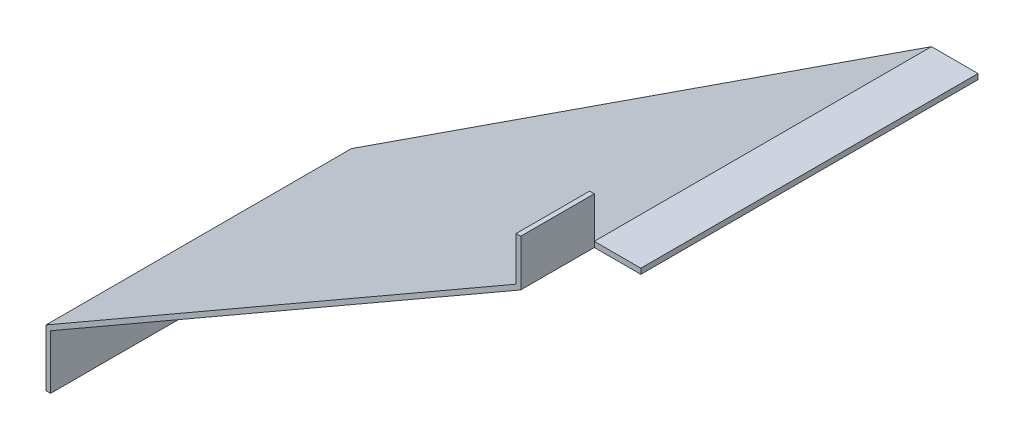
ISO-10303-21;
HEADER;
FILE_DESCRIPTION(('STEP AP214'),'2;1');
FILE_NAME('part.step','',(''),(''),'','','');
FILE_SCHEMA(('AUTOMOTIVE_DESIGN { 1 0 10303 214 1 1 1 1 }'));
ENDSEC;
DATA;
#1=APPLICATION_CONTEXT('core data for automotive mechanical design processes');
#2=APPLICATION_PROTOCOL_DEFINITION('international standard','automotive_design',2000,#1);
#3=PRODUCT_CONTEXT('',#1,'mechanical');
#4=PRODUCT('Part','Part','',(#3));
#5=PRODUCT_RELATED_PRODUCT_CATEGORY('part','',(#4));
#6=PRODUCT_DEFINITION_FORMATION('','',#4);
#7=PRODUCT_DEFINITION_CONTEXT('part definition',#1,'design');
#8=PRODUCT_DEFINITION('design','',#6,#7);
#9=PRODUCT_DEFINITION_SHAPE('','',#8);
#10=(LENGTH_UNIT() NAMED_UNIT(*) SI_UNIT(.MILLI.,.METRE.));
#11=(NAMED_UNIT(*) PLANE_ANGLE_UNIT() SI_UNIT($,.RADIAN.));
#12=(NAMED_UNIT(*) SI_UNIT($,.STERADIAN.) SOLID_ANGLE_UNIT());
#13=UNCERTAINTY_MEASURE_WITH_UNIT(LENGTH_MEASURE(1.E-05),#10,'distance_accuracy_value','');
#14=(GEOMETRIC_REPRESENTATION_CONTEXT(3) GLOBAL_UNCERTAINTY_ASSIGNED_CONTEXT((#13)) GLOBAL_UNIT_ASSIGNED_CONTEXT((#10,
#11,#12)) REPRESENTATION_CONTEXT('',''));
#15=CARTESIAN_POINT('',(0.,0.,0.));
#16=DIRECTION('',(0.,0.,1.));
#17=DIRECTION('',(1.,0.,0.));
#18=AXIS2_PLACEMENT_3D('',#15,#16,#17);
#19=CARTESIAN_POINT('',(29.337,-633.388813657917,860.382512117968));
#20=DIRECTION('',(0.,1.,0.));
#21=DIRECTION('',(1.,0.,0.));
#22=AXIS2_PLACEMENT_3D('',#19,#20,#21);
#23=PLANE('',#22);
#24=DIRECTION('',(0.,0.,-1.));
#25=VECTOR('',#24,1.);
#26=CARTESIAN_POINT('',(26.162,-633.388813657917,860.382512117968));
#27=LINE('',#26,#25);
#28=CARTESIAN_POINT('',(26.162,-633.388813657917,964.565));
#29=VERTEX_POINT('',#28);
#30=CARTESIAN_POINT('',(26.162,-633.388813657917,756.200024235936));
#31=VERTEX_POINT('',#30);
#32=EDGE_CURVE('E230',#29,#31,#27,.T.);
#33=ORIENTED_EDGE('',*,*,#32,.T.);
#34=DIRECTION('',(-1.,0.,0.));
#35=VECTOR('',#34,1.);
#36=CARTESIAN_POINT('',(29.337,-633.388813657917,756.200024235936));
#37=LINE('',#36,#35);
#38=CARTESIAN_POINT('',(29.337,-633.388813657917,756.200024235936));
#39=VERTEX_POINT('',#38);
#40=EDGE_CURVE('E20',#39,#31,#37,.T.);
#41=ORIENTED_EDGE('',*,*,#40,.F.);
#42=DIRECTION('',(0.,0.,-1.));
#43=VECTOR('',#42,1.);
#44=CARTESIAN_POINT('',(29.337,-633.388813657917,860.382512117968));
#45=LINE('',#44,#43);
#46=CARTESIAN_POINT('',(29.337,-633.388813657917,964.565));
#47=VERTEX_POINT('',#46);
#48=EDGE_CURVE('E11',#47,#39,#45,.T.);
#49=ORIENTED_EDGE('',*,*,#48,.F.);
#50=DIRECTION('',(-1.,0.,0.));
#51=VECTOR('',#50,1.);
#52=CARTESIAN_POINT('',(29.337,-633.388813657917,964.565));
#53=LINE('',#52,#51);
#54=EDGE_CURVE('E268',#47,#29,#53,.T.);
#55=ORIENTED_EDGE('',*,*,#54,.T.);
#56=EDGE_LOOP('',(#33,#41,#49,#55));
#57=FACE_BOUND('',#56,.T.);
#58=ADVANCED_FACE('F17',(#57),#23,.F.);
#59=CARTESIAN_POINT('',(29.337,-613.971504257917,860.382512117968));
#60=DIRECTION('',(-1.,0.,0.));
#61=DIRECTION('',(0.,1.,0.));
#62=AXIS2_PLACEMENT_3D('',#59,#60,#61);
#63=PLANE('',#62);
#64=DIRECTION('',(0.,-1.,0.));
#65=VECTOR('',#64,1.);
#66=CARTESIAN_POINT('',(29.337,-615.802809002632,756.200024235936));
#67=LINE('',#66,#65);
#68=CARTESIAN_POINT('',(29.337,-596.390857121367,756.200024235936));
#69=VERTEX_POINT('',#68);
#70=EDGE_CURVE('E228',#69,#39,#67,.T.);
#71=ORIENTED_EDGE('',*,*,#70,.F.);
#72=DIRECTION('',(0.,0.,1.));
#73=VECTOR('',#72,1.);
#74=CARTESIAN_POINT('',(29.337,-596.390857121367,136.396));
#75=LINE('',#74,#73);
#76=CARTESIAN_POINT('',(29.337,-596.390857121367,964.565));
#77=VERTEX_POINT('',#76);
#78=EDGE_CURVE('E250',#69,#77,#75,.T.);
#79=ORIENTED_EDGE('',*,*,#78,.T.);
#80=DIRECTION('',(0.,-1.,0.));
#81=VECTOR('',#80,1.);
#82=CARTESIAN_POINT('',(29.337,-615.802809002632,964.565));
#83=LINE('',#82,#81);
#84=EDGE_CURVE('E272',#77,#47,#83,.T.);
#85=ORIENTED_EDGE('',*,*,#84,.T.);
#86=ORIENTED_EDGE('',*,*,#48,.T.);
#87=EDGE_LOOP('',(#71,#79,#85,#86));
#88=FACE_BOUND('',#87,.T.);
#89=ADVANCED_FACE('F305',(#88),#63,.F.);
#90=CARTESIAN_POINT('',(29.337,-615.802809002632,756.200024235936));
#91=DIRECTION('',(0.,0.,-1.));
#92=DIRECTION('',(0.,-1.,0.));
#93=AXIS2_PLACEMENT_3D('',#90,#91,#92);
#94=PLANE('',#93);
#95=DIRECTION('',(-0.866868283163186,-0.498537239978831,0.));
#96=VECTOR('',#95,1.);
#97=CARTESIAN_POINT('',(187.706,-505.312609489431,756.200024235936));
#98=LINE('',#97,#96);
#99=CARTESIAN_POINT('',(26.162,-598.216804347348,756.200024235936));
#100=VERTEX_POINT('',#99);
#101=EDGE_CURVE('E253',#69,#100,#98,.T.);
#102=ORIENTED_EDGE('',*,*,#101,.F.);
#103=ORIENTED_EDGE('',*,*,#70,.T.);
#104=ORIENTED_EDGE('',*,*,#40,.T.);
#105=DIRECTION('',(0.,-1.,0.));
#106=VECTOR('',#105,1.);
#107=CARTESIAN_POINT('',(26.162,-615.802809002632,756.200024235936));
#108=LINE('',#107,#106);
#109=EDGE_CURVE('E223',#100,#31,#108,.T.);
#110=ORIENTED_EDGE('',*,*,#109,.F.);
#111=EDGE_LOOP('',(#102,#103,#104,#110));
#112=FACE_BOUND('',#111,.T.);
#113=ADVANCED_FACE('F266',(#112),#94,.T.);
#114=CARTESIAN_POINT('',(26.162,-589.865183129732,724.281));
#115=DIRECTION('',(-1.,0.,0.));
#116=DIRECTION('',(0.,1.,0.));
#117=AXIS2_PLACEMENT_3D('',#114,#115,#116);
#118=PLANE('',#117);
#119=DIRECTION('',(0.,-1.,0.));
#120=VECTOR('',#119,1.);
#121=CARTESIAN_POINT('',(26.162,-660.4,756.200024235936));
#122=LINE('',#121,#120);
#123=CARTESIAN_POINT('',(26.162,-594.554194857917,756.200024235936));
#124=VERTEX_POINT('',#123);
#125=EDGE_CURVE('E139',#124,#100,#122,.T.);
#126=ORIENTED_EDGE('',*,*,#125,.T.);
#127=ORIENTED_EDGE('',*,*,#109,.T.);
#128=ORIENTED_EDGE('',*,*,#32,.F.);
#129=DIRECTION('',(0.,-1.,0.));
#130=VECTOR('',#129,1.);
#131=CARTESIAN_POINT('',(26.162,-589.865183129732,964.565));
#132=LINE('',#131,#130);
#133=CARTESIAN_POINT('',(26.162,-594.554194857917,964.565));
#134=VERTEX_POINT('',#133);
#135=EDGE_CURVE('E142',#134,#29,#132,.T.);
#136=ORIENTED_EDGE('',*,*,#135,.F.);
#137=DIRECTION('',(0.,0.,1.));
#138=VECTOR('',#137,1.);
#139=CARTESIAN_POINT('',(26.162,-594.554194857917,724.281));
#140=LINE('',#139,#138);
#141=EDGE_CURVE('E134',#124,#134,#140,.T.);
#142=ORIENTED_EDGE('',*,*,#141,.F.);
#143=EDGE_LOOP('',(#126,#127,#128,#136,#142));
#144=FACE_BOUND('',#143,.T.);
#145=ADVANCED_FACE('F136',(#144),#118,.T.);
#146=CARTESIAN_POINT('',(381.762,-396.095187297279,824.48460386951));
#147=DIRECTION('',(1.,0.,0.));
#148=DIRECTION('',(0.,1.,0.));
#149=AXIS2_PLACEMENT_3D('',#146,#147,#148);
#150=PLANE('',#149);
#151=DIRECTION('',(0.,0.,-1.));
#152=VECTOR('',#151,1.);
#153=CARTESIAN_POINT('',(381.762,-408.307577807848,136.396));
#154=LINE('',#153,#152);
#155=CARTESIAN_POINT('',(381.762,-408.307577807848,914.4));
#156=VERTEX_POINT('',#155);
#157=CARTESIAN_POINT('',(381.762,-408.307577807848,684.40420773902));
#158=VERTEX_POINT('',#157);
#159=EDGE_CURVE('E197',#156,#158,#154,.T.);
#160=ORIENTED_EDGE('',*,*,#159,.F.);
#161=DIRECTION('',(0.,-1.,0.));
#162=VECTOR('',#161,1.);
#163=CARTESIAN_POINT('',(381.762,-410.138882552564,914.4));
#164=LINE('',#163,#162);
#165=CARTESIAN_POINT('',(381.762,-411.970187297279,914.4));
#166=VERTEX_POINT('',#165);
#167=EDGE_CURVE('E188',#156,#166,#164,.T.);
#168=ORIENTED_EDGE('',*,*,#167,.T.);
#169=DIRECTION('',(0.,0.,1.));
#170=VECTOR('',#169,1.);
#171=CARTESIAN_POINT('',(381.762,-411.970187297279,136.396));
#172=LINE('',#171,#170);
#173=CARTESIAN_POINT('',(381.762,-411.970187297279,684.40420773902));
#174=VERTEX_POINT('',#173);
#175=EDGE_CURVE('E187',#174,#166,#172,.T.);
#176=ORIENTED_EDGE('',*,*,#175,.F.);
#177=DIRECTION('',(0.,1.,0.));
#178=VECTOR('',#177,1.);
#179=CARTESIAN_POINT('',(381.762,-325.12,684.40420773902));
#180=LINE('',#179,#178);
#181=EDGE_CURVE('E220',#174,#158,#180,.T.);
#182=ORIENTED_EDGE('',*,*,#181,.T.);
#183=EDGE_LOOP('',(#160,#168,#176,#182));
#184=FACE_BOUND('',#183,.T.);
#185=ADVANCED_FACE('F325',(#184),#150,.T.);
#186=CARTESIAN_POINT('',(381.762,-325.12,684.40420773902));
#187=DIRECTION('',(0.,0.,1.));
#188=DIRECTION('',(1.,0.,0.));
#189=AXIS2_PLACEMENT_3D('',#186,#187,#188);
#190=PLANE('',#189);
#191=DIRECTION('',(0.,1.,0.));
#192=VECTOR('',#191,1.);
#193=CARTESIAN_POINT('',(350.012,-325.12,684.40420773902));
#194=LINE('',#193,#192);
#195=CARTESIAN_POINT('',(350.012,-411.970187297279,684.40420773902));
#196=VERTEX_POINT('',#195);
#197=CARTESIAN_POINT('',(350.012,-408.307577807848,684.40420773902));
#198=VERTEX_POINT('',#197);
#199=EDGE_CURVE('E161',#196,#198,#194,.T.);
#200=ORIENTED_EDGE('',*,*,#199,.T.);
#201=DIRECTION('',(-1.,0.,0.));
#202=VECTOR('',#201,1.);
#203=CARTESIAN_POINT('',(381.762,-408.307577807848,684.40420773902));
#204=LINE('',#203,#202);
#205=EDGE_CURVE('E193',#158,#198,#204,.T.);
#206=ORIENTED_EDGE('',*,*,#205,.F.);
#207=ORIENTED_EDGE('',*,*,#181,.F.);
#208=DIRECTION('',(-1.,0.,0.));
#209=VECTOR('',#208,1.);
#210=CARTESIAN_POINT('',(381.762,-411.970187297279,684.40420773902));
#211=LINE('',#210,#209);
#212=EDGE_CURVE('E185',#174,#196,#211,.T.);
#213=ORIENTED_EDGE('',*,*,#212,.T.);
#214=EDGE_LOOP('',(#200,#206,#207,#213));
#215=FACE_BOUND('',#214,.T.);
#216=ADVANCED_FACE('F322',(#215),#190,.F.);
#217=CARTESIAN_POINT('',(381.762,-411.970187297279,136.396));
#218=DIRECTION('',(0.,-1.,0.));
#219=DIRECTION('',(0.,0.,-1.));
#220=AXIS2_PLACEMENT_3D('',#217,#218,#219);
#221=PLANE('',#220);
#222=DIRECTION('',(0.,0.,1.));
#223=VECTOR('',#222,1.);
#224=CARTESIAN_POINT('',(350.012,-411.970187297279,136.396));
#225=LINE('',#224,#223);
#226=CARTESIAN_POINT('',(350.012,-411.970187297279,914.4));
#227=VERTEX_POINT('',#226);
#228=EDGE_CURVE('E174',#196,#227,#225,.T.);
#229=ORIENTED_EDGE('',*,*,#228,.F.);
#230=ORIENTED_EDGE('',*,*,#212,.F.);
#231=ORIENTED_EDGE('',*,*,#175,.T.);
#232=DIRECTION('',(-1.,0.,0.));
#233=VECTOR('',#232,1.);
#234=CARTESIAN_POINT('',(381.762,-411.970187297279,914.4));
#235=LINE('',#234,#233);
#236=EDGE_CURVE('E196',#166,#227,#235,.T.);
#237=ORIENTED_EDGE('',*,*,#236,.T.);
#238=EDGE_LOOP('',(#229,#230,#231,#237));
#239=FACE_BOUND('',#238,.T.);
#240=ADVANCED_FACE('F320',(#239),#221,.T.);
#241=CARTESIAN_POINT('',(381.762,-410.138882552564,914.4));
#242=DIRECTION('',(0.,0.,-1.));
#243=DIRECTION('',(0.,-1.,0.));
#244=AXIS2_PLACEMENT_3D('',#241,#242,#243);
#245=PLANE('',#244);
#246=DIRECTION('',(0.,-1.,0.));
#247=VECTOR('',#246,1.);
#248=CARTESIAN_POINT('',(350.012,-410.138882552564,914.4));
#249=LINE('',#248,#247);
#250=CARTESIAN_POINT('',(350.012,-408.307577807848,914.4));
#251=VERTEX_POINT('',#250);
#252=EDGE_CURVE('E178',#251,#227,#249,.T.);
#253=ORIENTED_EDGE('',*,*,#252,.T.);
#254=ORIENTED_EDGE('',*,*,#236,.F.);
#255=ORIENTED_EDGE('',*,*,#167,.F.);
#256=DIRECTION('',(-1.,0.,0.));
#257=VECTOR('',#256,1.);
#258=CARTESIAN_POINT('',(381.762,-408.307577807848,914.4));
#259=LINE('',#258,#257);
#260=EDGE_CURVE('E212',#156,#251,#259,.T.);
#261=ORIENTED_EDGE('',*,*,#260,.T.);
#262=EDGE_LOOP('',(#253,#254,#255,#261));
#263=FACE_BOUND('',#262,.T.);
#264=ADVANCED_FACE('F317',(#263),#245,.F.);
#265=CARTESIAN_POINT('',(381.762,-408.307577807848,136.396));
#266=DIRECTION('',(0.,1.,0.));
#267=DIRECTION('',(1.,0.,0.));
#268=AXIS2_PLACEMENT_3D('',#265,#266,#267);
#269=PLANE('',#268);
#270=DIRECTION('',(0.,0.,-1.));
#271=VECTOR('',#270,1.);
#272=CARTESIAN_POINT('',(350.012,-408.307577807848,136.396));
#273=LINE('',#272,#271);
#274=EDGE_CURVE('E156',#251,#198,#273,.T.);
#275=ORIENTED_EDGE('',*,*,#274,.F.);
#276=ORIENTED_EDGE('',*,*,#260,.F.);
#277=ORIENTED_EDGE('',*,*,#159,.T.);
#278=ORIENTED_EDGE('',*,*,#205,.T.);
#279=EDGE_LOOP('',(#275,#276,#277,#278));
#280=FACE_BOUND('',#279,.T.);
#281=ADVANCED_FACE('F315',(#280),#269,.T.);
#282=CARTESIAN_POINT('',(346.837,-380.220187297279,939.4825));
#283=DIRECTION('',(0.,-1.,0.));
#284=DIRECTION('',(0.,0.,-1.));
#285=AXIS2_PLACEMENT_3D('',#282,#283,#284);
#286=PLANE('',#285);
#287=DIRECTION('',(0.,0.,-1.));
#288=VECTOR('',#287,1.);
#289=CARTESIAN_POINT('',(350.012,-380.220187297279,939.4825));
#290=LINE('',#289,#288);
#291=CARTESIAN_POINT('',(350.012,-380.220187297279,964.565));
#292=VERTEX_POINT('',#291);
#293=CARTESIAN_POINT('',(350.012,-380.220187297279,914.4));
#294=VERTEX_POINT('',#293);
#295=EDGE_CURVE('E148',#292,#294,#290,.T.);
#296=ORIENTED_EDGE('',*,*,#295,.T.);
#297=DIRECTION('',(1.,0.,0.));
#298=VECTOR('',#297,1.);
#299=CARTESIAN_POINT('',(346.837,-380.220187297279,914.4));
#300=LINE('',#299,#298);
#301=CARTESIAN_POINT('',(346.837,-380.220187297279,914.4));
#302=VERTEX_POINT('',#301);
#303=EDGE_CURVE('E206',#302,#294,#300,.T.);
#304=ORIENTED_EDGE('',*,*,#303,.F.);
#305=DIRECTION('',(0.,0.,-1.));
#306=VECTOR('',#305,1.);
#307=CARTESIAN_POINT('',(346.837,-380.220187297279,939.4825));
#308=LINE('',#307,#306);
#309=CARTESIAN_POINT('',(346.837,-380.220187297279,964.565));
#310=VERTEX_POINT('',#309);
#311=EDGE_CURVE('E209',#310,#302,#308,.T.);
#312=ORIENTED_EDGE('',*,*,#311,.F.);
#313=DIRECTION('',(1.,0.,0.));
#314=VECTOR('',#313,1.);
#315=CARTESIAN_POINT('',(346.837,-380.220187297279,964.565));
#316=LINE('',#315,#314);
#317=EDGE_CURVE('E245',#310,#292,#316,.T.);
#318=ORIENTED_EDGE('',*,*,#317,.T.);
#319=EDGE_LOOP('',(#296,#304,#312,#318));
#320=FACE_BOUND('',#319,.T.);
#321=ADVANCED_FACE('F303',(#320),#286,.F.);
#322=CARTESIAN_POINT('',(346.837,-396.095187297279,939.4825));
#323=DIRECTION('',(1.,0.,0.));
#324=DIRECTION('',(0.,1.,0.));
#325=AXIS2_PLACEMENT_3D('',#322,#323,#324);
#326=PLANE('',#325);
#327=DIRECTION('',(0.,1.,0.));
#328=VECTOR('',#327,1.);
#329=CARTESIAN_POINT('',(346.837,-394.263882552564,914.4));
#330=LINE('',#329,#328);
#331=CARTESIAN_POINT('',(346.837,-410.133525033829,914.4));
#332=VERTEX_POINT('',#331);
#333=EDGE_CURVE('E202',#332,#302,#330,.T.);
#334=ORIENTED_EDGE('',*,*,#333,.F.);
#335=DIRECTION('',(0.,0.,1.));
#336=VECTOR('',#335,1.);
#337=CARTESIAN_POINT('',(346.837,-410.133525033829,136.396));
#338=LINE('',#337,#336);
#339=CARTESIAN_POINT('',(346.837,-410.133525033829,964.565));
#340=VERTEX_POINT('',#339);
#341=EDGE_CURVE('E147',#332,#340,#338,.T.);
#342=ORIENTED_EDGE('',*,*,#341,.T.);
#343=DIRECTION('',(0.,1.,0.));
#344=VECTOR('',#343,1.);
#345=CARTESIAN_POINT('',(346.837,-394.263882552564,964.565));
#346=LINE('',#345,#344);
#347=EDGE_CURVE('E246',#340,#310,#346,.T.);
#348=ORIENTED_EDGE('',*,*,#347,.T.);
#349=ORIENTED_EDGE('',*,*,#311,.T.);
#350=EDGE_LOOP('',(#334,#342,#348,#349));
#351=FACE_BOUND('',#350,.T.);
#352=ADVANCED_FACE('F353',(#351),#326,.F.);
#353=CARTESIAN_POINT('',(346.837,-394.263882552564,914.4));
#354=DIRECTION('',(0.,0.,-1.));
#355=DIRECTION('',(0.,-1.,0.));
#356=AXIS2_PLACEMENT_3D('',#353,#354,#355);
#357=PLANE('',#356);
#358=DIRECTION('',(0.866868283163186,0.498537239978831,0.));
#359=VECTOR('',#358,1.);
#360=CARTESIAN_POINT('',(187.706,-501.65,914.4));
#361=LINE('',#360,#359);
#362=EDGE_CURVE('E192',#332,#251,#361,.T.);
#363=ORIENTED_EDGE('',*,*,#362,.F.);
#364=ORIENTED_EDGE('',*,*,#333,.T.);
#365=ORIENTED_EDGE('',*,*,#303,.T.);
#366=DIRECTION('',(0.,1.,0.));
#367=VECTOR('',#366,1.);
#368=CARTESIAN_POINT('',(350.012,-394.263882552564,914.4));
#369=LINE('',#368,#367);
#370=EDGE_CURVE('E181',#251,#294,#369,.T.);
#371=ORIENTED_EDGE('',*,*,#370,.F.);
#372=EDGE_LOOP('',(#363,#364,#365,#371));
#373=FACE_BOUND('',#372,.T.);
#374=ADVANCED_FACE('F355',(#373),#357,.T.);
#375=CARTESIAN_POINT('',(187.706,-501.65,136.396));
#376=DIRECTION('',(0.498537239978831,-0.866868283163186,0.));
#377=DIRECTION('',(0.,0.,-1.));
#378=AXIS2_PLACEMENT_3D('',#375,#376,#377);
#379=PLANE('',#378);
#380=DIRECTION('',(-0.851290383944916,-0.489578366950732,0.188726534479847));
#381=VECTOR('',#380,1.);
#382=CARTESIAN_POINT('',(281.530559893111,-447.691355947805,699.586177500819));
#383=LINE('',#382,#381);
#384=EDGE_CURVE('E152',#198,#124,#383,.T.);
#385=ORIENTED_EDGE('',*,*,#384,.T.);
#386=ORIENTED_EDGE('',*,*,#141,.T.);
#387=DIRECTION('',(0.866868283163186,0.498537239978831,0.));
#388=VECTOR('',#387,1.);
#389=CARTESIAN_POINT('',(187.706,-501.65,964.565));
#390=LINE('',#389,#388);
#391=EDGE_CURVE('E249',#134,#340,#390,.T.);
#392=ORIENTED_EDGE('',*,*,#391,.T.);
#393=ORIENTED_EDGE('',*,*,#341,.F.);
#394=ORIENTED_EDGE('',*,*,#362,.T.);
#395=ORIENTED_EDGE('',*,*,#274,.T.);
#396=EDGE_LOOP('',(#385,#386,#392,#393,#394,#395));
#397=FACE_BOUND('',#396,.T.);
#398=ADVANCED_FACE('F153',(#397),#379,.F.);
#399=CARTESIAN_POINT('',(350.012,-325.12,939.8));
#400=DIRECTION('',(-1.,0.,0.));
#401=DIRECTION('',(0.,0.,1.));
#402=AXIS2_PLACEMENT_3D('',#399,#400,#401);
#403=PLANE('',#402);
#404=ORIENTED_EDGE('',*,*,#252,.F.);
#405=ORIENTED_EDGE('',*,*,#370,.T.);
#406=ORIENTED_EDGE('',*,*,#295,.F.);
#407=DIRECTION('',(0.,-1.,0.));
#408=VECTOR('',#407,1.);
#409=CARTESIAN_POINT('',(350.012,-330.2,964.565));
#410=LINE('',#409,#408);
#411=CARTESIAN_POINT('',(350.012,-411.970187297279,964.565));
#412=VERTEX_POINT('',#411);
#413=EDGE_CURVE('E290',#292,#412,#410,.T.);
#414=ORIENTED_EDGE('',*,*,#413,.T.);
#415=DIRECTION('',(0.,0.,1.));
#416=VECTOR('',#415,1.);
#417=CARTESIAN_POINT('',(350.012,-411.970187297279,136.396));
#418=LINE('',#417,#416);
#419=EDGE_CURVE('E168',#227,#412,#418,.T.);
#420=ORIENTED_EDGE('',*,*,#419,.F.);
#421=EDGE_LOOP('',(#404,#405,#406,#414,#420));
#422=FACE_BOUND('',#421,.T.);
#423=ADVANCED_FACE('F438',(#422),#403,.F.);
#424=CARTESIAN_POINT('',(359.537,-660.4,682.292566077346));
#425=DIRECTION('',(0.216439613938103,0.,0.976296007119933));
#426=DIRECTION('',(0.,-1.,0.));
#427=AXIS2_PLACEMENT_3D('',#424,#425,#426);
#428=PLANE('',#427);
#429=ORIENTED_EDGE('',*,*,#125,.F.);
#430=ORIENTED_EDGE('',*,*,#384,.F.);
#431=ORIENTED_EDGE('',*,*,#199,.F.);
#432=DIRECTION('',(0.851290383944916,0.489578366950732,-0.188726534479847));
#433=VECTOR('',#432,1.);
#434=CARTESIAN_POINT('',(281.530559893111,-451.353965437236,699.586177500819));
#435=LINE('',#434,#433);
#436=EDGE_CURVE('E165',#100,#196,#435,.T.);
#437=ORIENTED_EDGE('',*,*,#436,.F.);
#438=EDGE_LOOP('',(#429,#430,#431,#437));
#439=FACE_BOUND('',#438,.T.);
#440=ADVANCED_FACE('F163',(#439),#428,.F.);
#441=CARTESIAN_POINT('',(187.706,-505.312609489431,136.396));
#442=DIRECTION('',(-0.498537239978831,0.866868283163186,0.));
#443=DIRECTION('',(0.,0.,1.));
#444=AXIS2_PLACEMENT_3D('',#441,#442,#443);
#445=PLANE('',#444);
#446=ORIENTED_EDGE('',*,*,#78,.F.);
#447=ORIENTED_EDGE('',*,*,#101,.T.);
#448=ORIENTED_EDGE('',*,*,#436,.T.);
#449=ORIENTED_EDGE('',*,*,#228,.T.);
#450=ORIENTED_EDGE('',*,*,#419,.T.);
#451=DIRECTION('',(-0.866868283163186,-0.498537239978831,0.));
#452=VECTOR('',#451,1.);
#453=CARTESIAN_POINT('',(187.706,-505.312609489431,964.565));
#454=LINE('',#453,#452);
#455=EDGE_CURVE('E286',#412,#77,#454,.T.);
#456=ORIENTED_EDGE('',*,*,#455,.T.);
#457=EDGE_LOOP('',(#446,#447,#448,#449,#450,#456));
#458=FACE_BOUND('',#457,.T.);
#459=ADVANCED_FACE('F263',(#458),#445,.F.);
#460=CARTESIAN_POINT('',(359.537,-330.2,964.565));
#461=DIRECTION('',(0.,0.,1.));
#462=DIRECTION('',(1.,0.,0.));
#463=AXIS2_PLACEMENT_3D('',#460,#461,#462);
#464=PLANE('',#463);
#465=ORIENTED_EDGE('',*,*,#135,.T.);
#466=ORIENTED_EDGE('',*,*,#54,.F.);
#467=ORIENTED_EDGE('',*,*,#84,.F.);
#468=ORIENTED_EDGE('',*,*,#455,.F.);
#469=ORIENTED_EDGE('',*,*,#413,.F.);
#470=ORIENTED_EDGE('',*,*,#317,.F.);
#471=ORIENTED_EDGE('',*,*,#347,.F.);
#472=ORIENTED_EDGE('',*,*,#391,.F.);
#473=EDGE_LOOP('',(#465,#466,#467,#468,#469,#470,#471,#472));
#474=FACE_BOUND('',#473,.T.);
#475=ADVANCED_FACE('F274',(#474),#464,.T.);
#476=CLOSED_SHELL('',(#58,#89,#113,#145,#185,#216,#240,#264,#281,#321,#352,#374,#398,#423,#440,
#459,#475));
#477=MANIFOLD_SOLID_BREP('B1',#476);
#478=ADVANCED_BREP_SHAPE_REPRESENTATION('',(#18,#477),#14);
#479=SHAPE_DEFINITION_REPRESENTATION(#9,#478);
ENDSEC;
END-ISO-10303-21;
